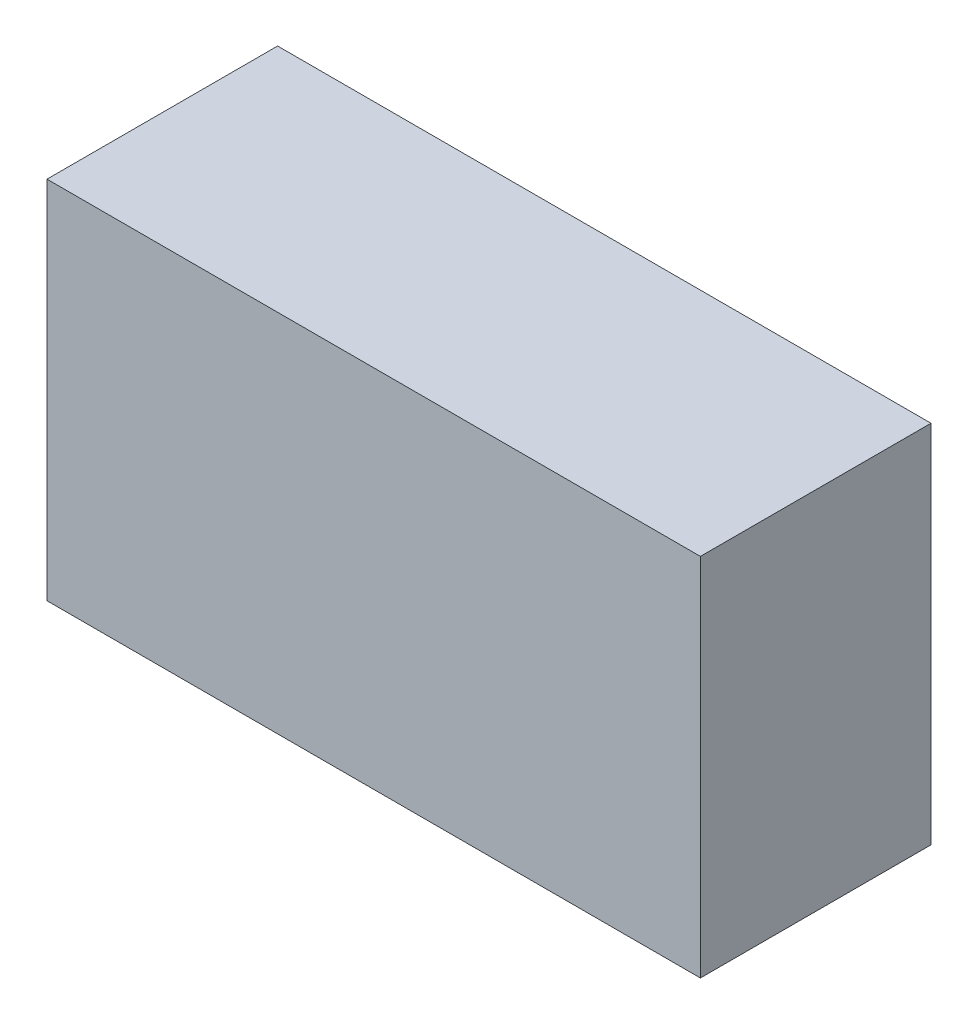
ISO-10303-21;
HEADER;
FILE_DESCRIPTION(('STEP AP214'),'2;1');
FILE_NAME('part.step','',(''),(''),'','','');
FILE_SCHEMA(('AUTOMOTIVE_DESIGN { 1 0 10303 214 1 1 1 1 }'));
ENDSEC;
DATA;
#1=APPLICATION_CONTEXT('core data for automotive mechanical design processes');
#2=APPLICATION_PROTOCOL_DEFINITION('international standard','automotive_design',2000,#1);
#3=PRODUCT_CONTEXT('',#1,'mechanical');
#4=PRODUCT('Part','Part','',(#3));
#5=PRODUCT_RELATED_PRODUCT_CATEGORY('part','',(#4));
#6=PRODUCT_DEFINITION_FORMATION('','',#4);
#7=PRODUCT_DEFINITION_CONTEXT('part definition',#1,'design');
#8=PRODUCT_DEFINITION('design','',#6,#7);
#9=PRODUCT_DEFINITION_SHAPE('','',#8);
#10=(LENGTH_UNIT() NAMED_UNIT(*) SI_UNIT(.MILLI.,.METRE.));
#11=(NAMED_UNIT(*) PLANE_ANGLE_UNIT() SI_UNIT($,.RADIAN.));
#12=(NAMED_UNIT(*) SI_UNIT($,.STERADIAN.) SOLID_ANGLE_UNIT());
#13=UNCERTAINTY_MEASURE_WITH_UNIT(LENGTH_MEASURE(1.E-05),#10,'distance_accuracy_value','');
#14=(GEOMETRIC_REPRESENTATION_CONTEXT(3) GLOBAL_UNCERTAINTY_ASSIGNED_CONTEXT((#13)) GLOBAL_UNIT_ASSIGNED_CONTEXT((#10,
#11,#12)) REPRESENTATION_CONTEXT('',''));
#15=CARTESIAN_POINT('',(0.,0.,0.));
#16=DIRECTION('',(0.,0.,1.));
#17=DIRECTION('',(1.,0.,0.));
#18=AXIS2_PLACEMENT_3D('',#15,#16,#17);
#19=CARTESIAN_POINT('',(-0.85000084,-0.47500032,0.5999988));
#20=DIRECTION('',(0.,0.,-1.));
#21=DIRECTION('',(-1.,0.,0.));
#22=AXIS2_PLACEMENT_3D('',#19,#20,#21);
#23=PLANE('',#22);
#24=DIRECTION('',(0.,1.,0.));
#25=VECTOR('',#24,1.);
#26=CARTESIAN_POINT('',(0.85000084,-0.47500032,0.5999988));
#27=LINE('',#26,#25);
#28=CARTESIAN_POINT('',(0.85000084,-0.47500032,0.5999988));
#29=VERTEX_POINT('',#28);
#30=CARTESIAN_POINT('',(0.85000084,0.47500032,0.5999988));
#31=VERTEX_POINT('',#30);
#32=EDGE_CURVE('E79',#29,#31,#27,.T.);
#33=ORIENTED_EDGE('',*,*,#32,.T.);
#34=DIRECTION('',(1.,0.,0.));
#35=VECTOR('',#34,1.);
#36=CARTESIAN_POINT('',(0.85000084,0.47500032,0.5999988));
#37=LINE('',#36,#35);
#38=CARTESIAN_POINT('',(-0.85000084,0.47500032,0.5999988));
#39=VERTEX_POINT('',#38);
#40=EDGE_CURVE('E55',#31,#39,#37,.F.);
#41=ORIENTED_EDGE('',*,*,#40,.T.);
#42=DIRECTION('',(0.,1.,0.));
#43=VECTOR('',#42,1.);
#44=CARTESIAN_POINT('',(-0.85000084,0.47500032,0.5999988));
#45=LINE('',#44,#43);
#46=CARTESIAN_POINT('',(-0.85000084,-0.47500032,0.5999988));
#47=VERTEX_POINT('',#46);
#48=EDGE_CURVE('E57',#39,#47,#45,.F.);
#49=ORIENTED_EDGE('',*,*,#48,.T.);
#50=DIRECTION('',(1.,0.,0.));
#51=VECTOR('',#50,1.);
#52=CARTESIAN_POINT('',(-0.85000084,-0.47500032,0.5999988));
#53=LINE('',#52,#51);
#54=EDGE_CURVE('E20',#47,#29,#53,.T.);
#55=ORIENTED_EDGE('',*,*,#54,.T.);
#56=EDGE_LOOP('',(#33,#41,#49,#55));
#57=FACE_BOUND('',#56,.T.);
#58=ADVANCED_FACE('F17',(#57),#23,.F.);
#59=CARTESIAN_POINT('',(-0.85000084,-0.47500032,0.));
#60=DIRECTION('',(0.,1.,0.));
#61=DIRECTION('',(0.,0.,1.));
#62=AXIS2_PLACEMENT_3D('',#59,#60,#61);
#63=PLANE('',#62);
#64=DIRECTION('',(-1.,0.,0.));
#65=VECTOR('',#64,1.);
#66=CARTESIAN_POINT('',(-0.85000084,-0.47500032,0.));
#67=LINE('',#66,#65);
#68=CARTESIAN_POINT('',(0.85000084,-0.47500032,0.));
#69=VERTEX_POINT('',#68);
#70=CARTESIAN_POINT('',(-0.85000084,-0.47500032,0.));
#71=VERTEX_POINT('',#70);
#72=EDGE_CURVE('E83',#69,#71,#67,.T.);
#73=ORIENTED_EDGE('',*,*,#72,.F.);
#74=DIRECTION('',(0.,0.,1.));
#75=VECTOR('',#74,1.);
#76=CARTESIAN_POINT('',(0.85000084,-0.47500032,0.));
#77=LINE('',#76,#75);
#78=EDGE_CURVE('E68',#69,#29,#77,.T.);
#79=ORIENTED_EDGE('',*,*,#78,.T.);
#80=ORIENTED_EDGE('',*,*,#54,.F.);
#81=DIRECTION('',(0.,0.,-1.));
#82=VECTOR('',#81,1.);
#83=CARTESIAN_POINT('',(-0.85000084,-0.47500032,0.));
#84=LINE('',#83,#82);
#85=EDGE_CURVE('E63',#47,#71,#84,.T.);
#86=ORIENTED_EDGE('',*,*,#85,.T.);
#87=EDGE_LOOP('',(#73,#79,#80,#86));
#88=FACE_BOUND('',#87,.T.);
#89=ADVANCED_FACE('F65',(#88),#63,.F.);
#90=CARTESIAN_POINT('',(-0.85000084,0.47500032,0.));
#91=DIRECTION('',(1.,0.,0.));
#92=DIRECTION('',(0.,0.,-1.));
#93=AXIS2_PLACEMENT_3D('',#90,#91,#92);
#94=PLANE('',#93);
#95=DIRECTION('',(0.,1.,0.));
#96=VECTOR('',#95,1.);
#97=CARTESIAN_POINT('',(-0.85000084,-0.47500032,0.));
#98=LINE('',#97,#96);
#99=CARTESIAN_POINT('',(-0.85000084,0.47500032,0.));
#100=VERTEX_POINT('',#99);
#101=EDGE_CURVE('E72',#71,#100,#98,.T.);
#102=ORIENTED_EDGE('',*,*,#101,.F.);
#103=ORIENTED_EDGE('',*,*,#85,.F.);
#104=ORIENTED_EDGE('',*,*,#48,.F.);
#105=DIRECTION('',(0.,0.,-1.));
#106=VECTOR('',#105,1.);
#107=CARTESIAN_POINT('',(-0.85000084,0.47500032,0.));
#108=LINE('',#107,#106);
#109=EDGE_CURVE('E75',#39,#100,#108,.T.);
#110=ORIENTED_EDGE('',*,*,#109,.T.);
#111=EDGE_LOOP('',(#102,#103,#104,#110));
#112=FACE_BOUND('',#111,.T.);
#113=ADVANCED_FACE('F70',(#112),#94,.F.);
#114=CARTESIAN_POINT('',(0.85000084,0.47500032,0.));
#115=DIRECTION('',(0.,-1.,0.));
#116=DIRECTION('',(0.,0.,-1.));
#117=AXIS2_PLACEMENT_3D('',#114,#115,#116);
#118=PLANE('',#117);
#119=DIRECTION('',(-1.,0.,0.));
#120=VECTOR('',#119,1.);
#121=CARTESIAN_POINT('',(-0.85000084,0.47500032,0.));
#122=LINE('',#121,#120);
#123=CARTESIAN_POINT('',(0.85000084,0.47500032,0.));
#124=VERTEX_POINT('',#123);
#125=EDGE_CURVE('E26',#100,#124,#122,.F.);
#126=ORIENTED_EDGE('',*,*,#125,.F.);
#127=ORIENTED_EDGE('',*,*,#109,.F.);
#128=ORIENTED_EDGE('',*,*,#40,.F.);
#129=DIRECTION('',(0.,0.,1.));
#130=VECTOR('',#129,1.);
#131=CARTESIAN_POINT('',(0.85000084,0.47500032,0.));
#132=LINE('',#131,#130);
#133=EDGE_CURVE('E35',#31,#124,#132,.F.);
#134=ORIENTED_EDGE('',*,*,#133,.T.);
#135=EDGE_LOOP('',(#126,#127,#128,#134));
#136=FACE_BOUND('',#135,.T.);
#137=ADVANCED_FACE('F89',(#136),#118,.F.);
#138=CARTESIAN_POINT('',(0.85000084,-0.47500032,0.));
#139=DIRECTION('',(-1.,0.,0.));
#140=DIRECTION('',(0.,0.,1.));
#141=AXIS2_PLACEMENT_3D('',#138,#139,#140);
#142=PLANE('',#141);
#143=DIRECTION('',(0.,1.,0.));
#144=VECTOR('',#143,1.);
#145=CARTESIAN_POINT('',(0.85000084,-0.47500032,0.));
#146=LINE('',#145,#144);
#147=EDGE_CURVE('E11',#124,#69,#146,.F.);
#148=ORIENTED_EDGE('',*,*,#147,.F.);
#149=ORIENTED_EDGE('',*,*,#133,.F.);
#150=ORIENTED_EDGE('',*,*,#32,.F.);
#151=ORIENTED_EDGE('',*,*,#78,.F.);
#152=EDGE_LOOP('',(#148,#149,#150,#151));
#153=FACE_BOUND('',#152,.T.);
#154=ADVANCED_FACE('F91',(#153),#142,.F.);
#155=CARTESIAN_POINT('',(-0.85000084,-0.47500032,0.));
#156=DIRECTION('',(0.,0.,-1.));
#157=DIRECTION('',(-1.,0.,0.));
#158=AXIS2_PLACEMENT_3D('',#155,#156,#157);
#159=PLANE('',#158);
#160=ORIENTED_EDGE('',*,*,#125,.T.);
#161=ORIENTED_EDGE('',*,*,#147,.T.);
#162=ORIENTED_EDGE('',*,*,#72,.T.);
#163=ORIENTED_EDGE('',*,*,#101,.T.);
#164=EDGE_LOOP('',(#160,#161,#162,#163));
#165=FACE_BOUND('',#164,.T.);
#166=ADVANCED_FACE('F88',(#165),#159,.T.);
#167=CLOSED_SHELL('',(#58,#89,#113,#137,#154,#166));
#168=MANIFOLD_SOLID_BREP('B1',#167);
#169=ADVANCED_BREP_SHAPE_REPRESENTATION('',(#18,#168),#14);
#170=SHAPE_DEFINITION_REPRESENTATION(#9,#169);
ENDSEC;
END-ISO-10303-21;
